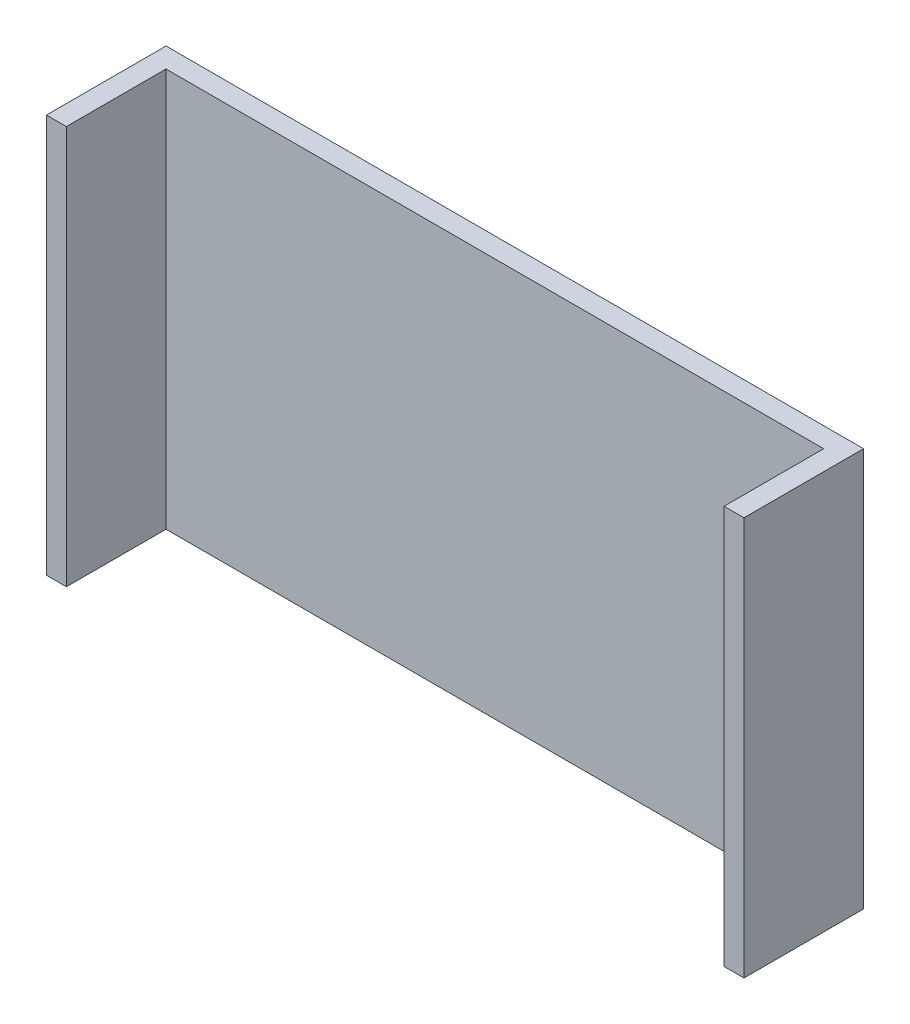
ISO-10303-21;
HEADER;
FILE_DESCRIPTION(('STEP AP214'),'2;1');
FILE_NAME('part.step','',(''),(''),'','','');
FILE_SCHEMA(('AUTOMOTIVE_DESIGN { 1 0 10303 214 1 1 1 1 }'));
ENDSEC;
DATA;
#1=APPLICATION_CONTEXT('core data for automotive mechanical design processes');
#2=APPLICATION_PROTOCOL_DEFINITION('international standard','automotive_design',2000,#1);
#3=PRODUCT_CONTEXT('',#1,'mechanical');
#4=PRODUCT('Part','Part','',(#3));
#5=PRODUCT_RELATED_PRODUCT_CATEGORY('part','',(#4));
#6=PRODUCT_DEFINITION_FORMATION('','',#4);
#7=PRODUCT_DEFINITION_CONTEXT('part definition',#1,'design');
#8=PRODUCT_DEFINITION('design','',#6,#7);
#9=PRODUCT_DEFINITION_SHAPE('','',#8);
#10=(LENGTH_UNIT() NAMED_UNIT(*) SI_UNIT(.MILLI.,.METRE.));
#11=(NAMED_UNIT(*) PLANE_ANGLE_UNIT() SI_UNIT($,.RADIAN.));
#12=(NAMED_UNIT(*) SI_UNIT($,.STERADIAN.) SOLID_ANGLE_UNIT());
#13=UNCERTAINTY_MEASURE_WITH_UNIT(LENGTH_MEASURE(1.E-05),#10,'distance_accuracy_value','');
#14=(GEOMETRIC_REPRESENTATION_CONTEXT(3) GLOBAL_UNCERTAINTY_ASSIGNED_CONTEXT((#13)) GLOBAL_UNIT_ASSIGNED_CONTEXT((#10,
#11,#12)) REPRESENTATION_CONTEXT('',''));
#15=CARTESIAN_POINT('',(0.,0.,0.));
#16=DIRECTION('',(0.,0.,1.));
#17=DIRECTION('',(1.,0.,0.));
#18=AXIS2_PLACEMENT_3D('',#15,#16,#17);
#19=CARTESIAN_POINT('',(0.,0.,2.));
#20=DIRECTION('',(0.,0.,1.));
#21=DIRECTION('',(1.,0.,0.));
#22=AXIS2_PLACEMENT_3D('',#19,#20,#21);
#23=PLANE('',#22);
#24=DIRECTION('',(1.,0.,0.));
#25=VECTOR('',#24,1.);
#26=CARTESIAN_POINT('',(-35.,-20.,2.));
#27=LINE('',#26,#25);
#28=CARTESIAN_POINT('',(-33.,-20.,2.));
#29=VERTEX_POINT('',#28);
#30=CARTESIAN_POINT('',(33.,-20.,2.));
#31=VERTEX_POINT('',#30);
#32=EDGE_CURVE('E165',#29,#31,#27,.T.);
#33=ORIENTED_EDGE('',*,*,#32,.T.);
#34=DIRECTION('',(0.,-1.,0.));
#35=VECTOR('',#34,1.);
#36=CARTESIAN_POINT('',(33.,0.,2.));
#37=LINE('',#36,#35);
#38=CARTESIAN_POINT('',(33.,20.,2.));
#39=VERTEX_POINT('',#38);
#40=EDGE_CURVE('E129',#39,#31,#37,.T.);
#41=ORIENTED_EDGE('',*,*,#40,.F.);
#42=DIRECTION('',(1.,0.,0.));
#43=VECTOR('',#42,1.);
#44=CARTESIAN_POINT('',(-35.,20.,2.));
#45=LINE('',#44,#43);
#46=CARTESIAN_POINT('',(-33.,20.,2.));
#47=VERTEX_POINT('',#46);
#48=EDGE_CURVE('E135',#47,#39,#45,.T.);
#49=ORIENTED_EDGE('',*,*,#48,.F.);
#50=DIRECTION('',(0.,-1.,0.));
#51=VECTOR('',#50,1.);
#52=CARTESIAN_POINT('',(-33.,0.,2.));
#53=LINE('',#52,#51);
#54=EDGE_CURVE('E137',#47,#29,#53,.T.);
#55=ORIENTED_EDGE('',*,*,#54,.T.);
#56=EDGE_LOOP('',(#33,#41,#49,#55));
#57=FACE_BOUND('',#56,.T.);
#58=ADVANCED_FACE('F39',(#57),#23,.T.);
#59=CARTESIAN_POINT('',(-35.,20.,2.));
#60=DIRECTION('',(1.,0.,0.));
#61=DIRECTION('',(0.,0.,-1.));
#62=AXIS2_PLACEMENT_3D('',#59,#60,#61);
#63=PLANE('',#62);
#64=DIRECTION('',(0.,-1.,0.));
#65=VECTOR('',#64,1.);
#66=CARTESIAN_POINT('',(-35.,20.,0.));
#67=LINE('',#66,#65);
#68=CARTESIAN_POINT('',(-35.,20.,0.));
#69=VERTEX_POINT('',#68);
#70=CARTESIAN_POINT('',(-35.,-20.,0.));
#71=VERTEX_POINT('',#70);
#72=EDGE_CURVE('E164',#69,#71,#67,.T.);
#73=ORIENTED_EDGE('',*,*,#72,.T.);
#74=DIRECTION('',(0.,0.,-1.));
#75=VECTOR('',#74,1.);
#76=CARTESIAN_POINT('',(-35.,-20.,2.));
#77=LINE('',#76,#75);
#78=CARTESIAN_POINT('',(-35.,-20.,12.));
#79=VERTEX_POINT('',#78);
#80=EDGE_CURVE('E11',#79,#71,#77,.T.);
#81=ORIENTED_EDGE('',*,*,#80,.F.);
#82=DIRECTION('',(0.,-1.,0.));
#83=VECTOR('',#82,1.);
#84=CARTESIAN_POINT('',(-35.,0.,12.));
#85=LINE('',#84,#83);
#86=CARTESIAN_POINT('',(-35.,20.,12.));
#87=VERTEX_POINT('',#86);
#88=EDGE_CURVE('E152',#87,#79,#85,.T.);
#89=ORIENTED_EDGE('',*,*,#88,.F.);
#90=DIRECTION('',(0.,0.,-1.));
#91=VECTOR('',#90,1.);
#92=CARTESIAN_POINT('',(-35.,20.,2.));
#93=LINE('',#92,#91);
#94=EDGE_CURVE('E63',#87,#69,#93,.T.);
#95=ORIENTED_EDGE('',*,*,#94,.T.);
#96=EDGE_LOOP('',(#73,#81,#89,#95));
#97=FACE_BOUND('',#96,.T.);
#98=ADVANCED_FACE('F41',(#97),#63,.F.);
#99=CARTESIAN_POINT('',(-35.,-20.,2.));
#100=DIRECTION('',(0.,1.,0.));
#101=DIRECTION('',(0.,0.,1.));
#102=AXIS2_PLACEMENT_3D('',#99,#100,#101);
#103=PLANE('',#102);
#104=DIRECTION('',(1.,0.,0.));
#105=VECTOR('',#104,1.);
#106=CARTESIAN_POINT('',(-35.,-20.,0.));
#107=LINE('',#106,#105);
#108=CARTESIAN_POINT('',(35.,-20.,0.));
#109=VERTEX_POINT('',#108);
#110=EDGE_CURVE('E174',#71,#109,#107,.T.);
#111=ORIENTED_EDGE('',*,*,#110,.T.);
#112=DIRECTION('',(0.,0.,-1.));
#113=VECTOR('',#112,1.);
#114=CARTESIAN_POINT('',(35.,-20.,2.));
#115=LINE('',#114,#113);
#116=CARTESIAN_POINT('',(35.,-20.,12.));
#117=VERTEX_POINT('',#116);
#118=EDGE_CURVE('E48',#117,#109,#115,.T.);
#119=ORIENTED_EDGE('',*,*,#118,.F.);
#120=DIRECTION('',(1.,0.,0.));
#121=VECTOR('',#120,1.);
#122=CARTESIAN_POINT('',(0.,-20.,12.));
#123=LINE('',#122,#121);
#124=CARTESIAN_POINT('',(33.,-20.,12.));
#125=VERTEX_POINT('',#124);
#126=EDGE_CURVE('E119',#125,#117,#123,.T.);
#127=ORIENTED_EDGE('',*,*,#126,.F.);
#128=DIRECTION('',(0.,0.,-1.));
#129=VECTOR('',#128,1.);
#130=CARTESIAN_POINT('',(33.,-20.,12.));
#131=LINE('',#130,#129);
#132=EDGE_CURVE('E114',#125,#31,#131,.T.);
#133=ORIENTED_EDGE('',*,*,#132,.T.);
#134=ORIENTED_EDGE('',*,*,#32,.F.);
#135=DIRECTION('',(0.,0.,-1.));
#136=VECTOR('',#135,1.);
#137=CARTESIAN_POINT('',(-33.,-20.,12.));
#138=LINE('',#137,#136);
#139=CARTESIAN_POINT('',(-33.,-20.,12.));
#140=VERTEX_POINT('',#139);
#141=EDGE_CURVE('E55',#140,#29,#138,.T.);
#142=ORIENTED_EDGE('',*,*,#141,.F.);
#143=DIRECTION('',(1.,0.,0.));
#144=VECTOR('',#143,1.);
#145=CARTESIAN_POINT('',(0.,-20.,12.));
#146=LINE('',#145,#144);
#147=EDGE_CURVE('E156',#79,#140,#146,.T.);
#148=ORIENTED_EDGE('',*,*,#147,.F.);
#149=ORIENTED_EDGE('',*,*,#80,.T.);
#150=EDGE_LOOP('',(#111,#119,#127,#133,#134,#142,#148,#149));
#151=FACE_BOUND('',#150,.T.);
#152=ADVANCED_FACE('F194',(#151),#103,.F.);
#153=CARTESIAN_POINT('',(35.,20.,2.));
#154=DIRECTION('',(1.,0.,0.));
#155=DIRECTION('',(0.,0.,-1.));
#156=AXIS2_PLACEMENT_3D('',#153,#154,#155);
#157=PLANE('',#156);
#158=DIRECTION('',(0.,-1.,0.));
#159=VECTOR('',#158,1.);
#160=CARTESIAN_POINT('',(35.,20.,0.));
#161=LINE('',#160,#159);
#162=CARTESIAN_POINT('',(35.,20.,0.));
#163=VERTEX_POINT('',#162);
#164=EDGE_CURVE('E178',#163,#109,#161,.T.);
#165=ORIENTED_EDGE('',*,*,#164,.F.);
#166=DIRECTION('',(0.,0.,-1.));
#167=VECTOR('',#166,1.);
#168=CARTESIAN_POINT('',(35.,20.,2.));
#169=LINE('',#168,#167);
#170=CARTESIAN_POINT('',(35.,20.,12.));
#171=VERTEX_POINT('',#170);
#172=EDGE_CURVE('E187',#171,#163,#169,.T.);
#173=ORIENTED_EDGE('',*,*,#172,.F.);
#174=DIRECTION('',(0.,1.,0.));
#175=VECTOR('',#174,1.);
#176=CARTESIAN_POINT('',(35.,0.,12.));
#177=LINE('',#176,#175);
#178=EDGE_CURVE('E126',#117,#171,#177,.T.);
#179=ORIENTED_EDGE('',*,*,#178,.F.);
#180=ORIENTED_EDGE('',*,*,#118,.T.);
#181=EDGE_LOOP('',(#165,#173,#179,#180));
#182=FACE_BOUND('',#181,.T.);
#183=ADVANCED_FACE('F192',(#182),#157,.T.);
#184=CARTESIAN_POINT('',(-35.,20.,2.));
#185=DIRECTION('',(0.,1.,0.));
#186=DIRECTION('',(0.,0.,1.));
#187=AXIS2_PLACEMENT_3D('',#184,#185,#186);
#188=PLANE('',#187);
#189=DIRECTION('',(1.,0.,0.));
#190=VECTOR('',#189,1.);
#191=CARTESIAN_POINT('',(-35.,20.,0.));
#192=LINE('',#191,#190);
#193=EDGE_CURVE('E169',#69,#163,#192,.T.);
#194=ORIENTED_EDGE('',*,*,#193,.F.);
#195=ORIENTED_EDGE('',*,*,#94,.F.);
#196=DIRECTION('',(-1.,0.,0.));
#197=VECTOR('',#196,1.);
#198=CARTESIAN_POINT('',(0.,20.,12.));
#199=LINE('',#198,#197);
#200=CARTESIAN_POINT('',(-33.,20.,12.));
#201=VERTEX_POINT('',#200);
#202=EDGE_CURVE('E148',#201,#87,#199,.T.);
#203=ORIENTED_EDGE('',*,*,#202,.F.);
#204=DIRECTION('',(0.,0.,-1.));
#205=VECTOR('',#204,1.);
#206=CARTESIAN_POINT('',(-33.,20.,12.));
#207=LINE('',#206,#205);
#208=EDGE_CURVE('E161',#201,#47,#207,.T.);
#209=ORIENTED_EDGE('',*,*,#208,.T.);
#210=ORIENTED_EDGE('',*,*,#48,.T.);
#211=DIRECTION('',(0.,0.,-1.));
#212=VECTOR('',#211,1.);
#213=CARTESIAN_POINT('',(33.,20.,12.));
#214=LINE('',#213,#212);
#215=CARTESIAN_POINT('',(33.,20.,12.));
#216=VERTEX_POINT('',#215);
#217=EDGE_CURVE('E111',#216,#39,#214,.T.);
#218=ORIENTED_EDGE('',*,*,#217,.F.);
#219=DIRECTION('',(-1.,0.,0.));
#220=VECTOR('',#219,1.);
#221=CARTESIAN_POINT('',(0.,20.,12.));
#222=LINE('',#221,#220);
#223=EDGE_CURVE('E120',#171,#216,#222,.T.);
#224=ORIENTED_EDGE('',*,*,#223,.F.);
#225=ORIENTED_EDGE('',*,*,#172,.T.);
#226=EDGE_LOOP('',(#194,#195,#203,#209,#210,#218,#224,#225));
#227=FACE_BOUND('',#226,.T.);
#228=ADVANCED_FACE('F133',(#227),#188,.T.);
#229=CARTESIAN_POINT('',(0.,0.,0.));
#230=DIRECTION('',(0.,0.,1.));
#231=DIRECTION('',(1.,0.,0.));
#232=AXIS2_PLACEMENT_3D('',#229,#230,#231);
#233=PLANE('',#232);
#234=ORIENTED_EDGE('',*,*,#72,.F.);
#235=ORIENTED_EDGE('',*,*,#193,.T.);
#236=ORIENTED_EDGE('',*,*,#164,.T.);
#237=ORIENTED_EDGE('',*,*,#110,.F.);
#238=EDGE_LOOP('',(#234,#235,#236,#237));
#239=FACE_BOUND('',#238,.T.);
#240=ADVANCED_FACE('F197',(#239),#233,.F.);
#241=CARTESIAN_POINT('',(-33.,0.,12.));
#242=DIRECTION('',(1.,0.,0.));
#243=DIRECTION('',(0.,0.,-1.));
#244=AXIS2_PLACEMENT_3D('',#241,#242,#243);
#245=PLANE('',#244);
#246=ORIENTED_EDGE('',*,*,#54,.F.);
#247=ORIENTED_EDGE('',*,*,#208,.F.);
#248=DIRECTION('',(0.,-1.,0.));
#249=VECTOR('',#248,1.);
#250=CARTESIAN_POINT('',(-33.,0.,12.));
#251=LINE('',#250,#249);
#252=EDGE_CURVE('E141',#201,#140,#251,.T.);
#253=ORIENTED_EDGE('',*,*,#252,.T.);
#254=ORIENTED_EDGE('',*,*,#141,.T.);
#255=EDGE_LOOP('',(#246,#247,#253,#254));
#256=FACE_BOUND('',#255,.T.);
#257=ADVANCED_FACE('F213',(#256),#245,.T.);
#258=CARTESIAN_POINT('',(0.,0.,12.));
#259=DIRECTION('',(0.,0.,1.));
#260=DIRECTION('',(1.,0.,0.));
#261=AXIS2_PLACEMENT_3D('',#258,#259,#260);
#262=PLANE('',#261);
#263=ORIENTED_EDGE('',*,*,#252,.F.);
#264=ORIENTED_EDGE('',*,*,#202,.T.);
#265=ORIENTED_EDGE('',*,*,#88,.T.);
#266=ORIENTED_EDGE('',*,*,#147,.T.);
#267=EDGE_LOOP('',(#263,#264,#265,#266));
#268=FACE_BOUND('',#267,.T.);
#269=ADVANCED_FACE('F201',(#268),#262,.T.);
#270=CARTESIAN_POINT('',(33.,0.,12.));
#271=DIRECTION('',(1.,0.,0.));
#272=DIRECTION('',(0.,0.,-1.));
#273=AXIS2_PLACEMENT_3D('',#270,#271,#272);
#274=PLANE('',#273);
#275=ORIENTED_EDGE('',*,*,#40,.T.);
#276=ORIENTED_EDGE('',*,*,#132,.F.);
#277=DIRECTION('',(0.,-1.,0.));
#278=VECTOR('',#277,1.);
#279=CARTESIAN_POINT('',(33.,0.,12.));
#280=LINE('',#279,#278);
#281=EDGE_CURVE('E107',#216,#125,#280,.T.);
#282=ORIENTED_EDGE('',*,*,#281,.F.);
#283=ORIENTED_EDGE('',*,*,#217,.T.);
#284=EDGE_LOOP('',(#275,#276,#282,#283));
#285=FACE_BOUND('',#284,.T.);
#286=ADVANCED_FACE('F109',(#285),#274,.F.);
#287=CARTESIAN_POINT('',(0.,0.,12.));
#288=DIRECTION('',(0.,0.,1.));
#289=DIRECTION('',(1.,0.,0.));
#290=AXIS2_PLACEMENT_3D('',#287,#288,#289);
#291=PLANE('',#290);
#292=ORIENTED_EDGE('',*,*,#223,.T.);
#293=ORIENTED_EDGE('',*,*,#281,.T.);
#294=ORIENTED_EDGE('',*,*,#126,.T.);
#295=ORIENTED_EDGE('',*,*,#178,.T.);
#296=EDGE_LOOP('',(#292,#293,#294,#295));
#297=FACE_BOUND('',#296,.T.);
#298=ADVANCED_FACE('F124',(#297),#291,.T.);
#299=CLOSED_SHELL('',(#58,#98,#152,#183,#228,#240,#257,#269,#286,#298));
#300=MANIFOLD_SOLID_BREP('B2',#299);
#301=ADVANCED_BREP_SHAPE_REPRESENTATION('',(#18,#300),#14);
#302=SHAPE_DEFINITION_REPRESENTATION(#9,#301);
ENDSEC;
END-ISO-10303-21;
